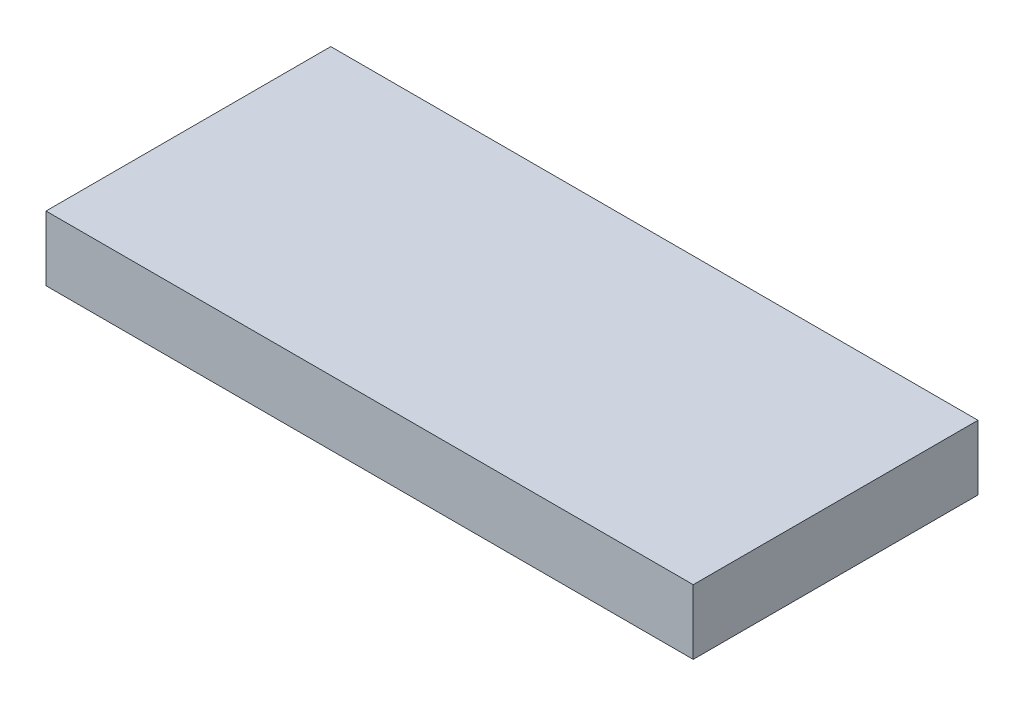
ISO-10303-21;
HEADER;
FILE_DESCRIPTION(('STEP AP214'),'2;1');
FILE_NAME('part.step','',(''),(''),'','','');
FILE_SCHEMA(('AUTOMOTIVE_DESIGN { 1 0 10303 214 1 1 1 1 }'));
ENDSEC;
DATA;
#1=APPLICATION_CONTEXT('core data for automotive mechanical design processes');
#2=APPLICATION_PROTOCOL_DEFINITION('international standard','automotive_design',2000,#1);
#3=PRODUCT_CONTEXT('',#1,'mechanical');
#4=PRODUCT('Part','Part','',(#3));
#5=PRODUCT_RELATED_PRODUCT_CATEGORY('part','',(#4));
#6=PRODUCT_DEFINITION_FORMATION('','',#4);
#7=PRODUCT_DEFINITION_CONTEXT('part definition',#1,'design');
#8=PRODUCT_DEFINITION('design','',#6,#7);
#9=PRODUCT_DEFINITION_SHAPE('','',#8);
#10=(LENGTH_UNIT() NAMED_UNIT(*) SI_UNIT(.MILLI.,.METRE.));
#11=(NAMED_UNIT(*) PLANE_ANGLE_UNIT() SI_UNIT($,.RADIAN.));
#12=(NAMED_UNIT(*) SI_UNIT($,.STERADIAN.) SOLID_ANGLE_UNIT());
#13=UNCERTAINTY_MEASURE_WITH_UNIT(LENGTH_MEASURE(1.E-05),#10,'distance_accuracy_value','');
#14=(GEOMETRIC_REPRESENTATION_CONTEXT(3) GLOBAL_UNCERTAINTY_ASSIGNED_CONTEXT((#13)) GLOBAL_UNIT_ASSIGNED_CONTEXT((#10,
#11,#12)) REPRESENTATION_CONTEXT('',''));
#15=CARTESIAN_POINT('',(0.,0.,0.));
#16=DIRECTION('',(0.,0.,1.));
#17=DIRECTION('',(1.,0.,0.));
#18=AXIS2_PLACEMENT_3D('',#15,#16,#17);
#19=CARTESIAN_POINT('',(0.,5.,0.));
#20=DIRECTION('',(1.,0.,0.));
#21=DIRECTION('',(0.,0.,-1.));
#22=AXIS2_PLACEMENT_3D('',#19,#20,#21);
#23=PLANE('',#22);
#24=DIRECTION('',(0.,0.,1.));
#25=VECTOR('',#24,1.);
#26=CARTESIAN_POINT('',(0.,0.,0.));
#27=LINE('',#26,#25);
#28=CARTESIAN_POINT('',(0.,0.,-22.));
#29=VERTEX_POINT('',#28);
#30=CARTESIAN_POINT('',(0.,0.,0.));
#31=VERTEX_POINT('',#30);
#32=EDGE_CURVE('E95',#29,#31,#27,.T.);
#33=ORIENTED_EDGE('',*,*,#32,.T.);
#34=DIRECTION('',(0.,-1.,0.));
#35=VECTOR('',#34,1.);
#36=CARTESIAN_POINT('',(0.,5.,0.));
#37=LINE('',#36,#35);
#38=CARTESIAN_POINT('',(0.,5.,0.));
#39=VERTEX_POINT('',#38);
#40=EDGE_CURVE('E11',#39,#31,#37,.T.);
#41=ORIENTED_EDGE('',*,*,#40,.F.);
#42=DIRECTION('',(0.,0.,1.));
#43=VECTOR('',#42,1.);
#44=CARTESIAN_POINT('',(0.,5.,0.));
#45=LINE('',#44,#43);
#46=CARTESIAN_POINT('',(0.,5.,-22.));
#47=VERTEX_POINT('',#46);
#48=EDGE_CURVE('E83',#47,#39,#45,.T.);
#49=ORIENTED_EDGE('',*,*,#48,.F.);
#50=DIRECTION('',(0.,-1.,0.));
#51=VECTOR('',#50,1.);
#52=CARTESIAN_POINT('',(0.,5.,-22.));
#53=LINE('',#52,#51);
#54=EDGE_CURVE('E91',#47,#29,#53,.T.);
#55=ORIENTED_EDGE('',*,*,#54,.T.);
#56=EDGE_LOOP('',(#33,#41,#49,#55));
#57=FACE_BOUND('',#56,.T.);
#58=ADVANCED_FACE('F32',(#57),#23,.F.);
#59=CARTESIAN_POINT('',(0.,5.,0.));
#60=DIRECTION('',(0.,0.,-1.));
#61=DIRECTION('',(-1.,0.,0.));
#62=AXIS2_PLACEMENT_3D('',#59,#60,#61);
#63=PLANE('',#62);
#64=DIRECTION('',(1.,0.,0.));
#65=VECTOR('',#64,1.);
#66=CARTESIAN_POINT('',(0.,0.,0.));
#67=LINE('',#66,#65);
#68=CARTESIAN_POINT('',(50.,0.,0.));
#69=VERTEX_POINT('',#68);
#70=EDGE_CURVE('E87',#31,#69,#67,.T.);
#71=ORIENTED_EDGE('',*,*,#70,.T.);
#72=DIRECTION('',(0.,-1.,0.));
#73=VECTOR('',#72,1.);
#74=CARTESIAN_POINT('',(50.,5.,0.));
#75=LINE('',#74,#73);
#76=CARTESIAN_POINT('',(50.,5.,0.));
#77=VERTEX_POINT('',#76);
#78=EDGE_CURVE('E40',#77,#69,#75,.T.);
#79=ORIENTED_EDGE('',*,*,#78,.F.);
#80=DIRECTION('',(1.,0.,0.));
#81=VECTOR('',#80,1.);
#82=CARTESIAN_POINT('',(0.,5.,0.));
#83=LINE('',#82,#81);
#84=EDGE_CURVE('E78',#39,#77,#83,.T.);
#85=ORIENTED_EDGE('',*,*,#84,.F.);
#86=ORIENTED_EDGE('',*,*,#40,.T.);
#87=EDGE_LOOP('',(#71,#79,#85,#86));
#88=FACE_BOUND('',#87,.T.);
#89=ADVANCED_FACE('F86',(#88),#63,.F.);
#90=CARTESIAN_POINT('',(50.,5.,0.));
#91=DIRECTION('',(-1.,0.,0.));
#92=DIRECTION('',(0.,0.,1.));
#93=AXIS2_PLACEMENT_3D('',#90,#91,#92);
#94=PLANE('',#93);
#95=DIRECTION('',(0.,0.,-1.));
#96=VECTOR('',#95,1.);
#97=CARTESIAN_POINT('',(50.,0.,0.));
#98=LINE('',#97,#96);
#99=CARTESIAN_POINT('',(50.,0.,-22.));
#100=VERTEX_POINT('',#99);
#101=EDGE_CURVE('E65',#69,#100,#98,.T.);
#102=ORIENTED_EDGE('',*,*,#101,.T.);
#103=DIRECTION('',(0.,-1.,0.));
#104=VECTOR('',#103,1.);
#105=CARTESIAN_POINT('',(50.,5.,-22.));
#106=LINE('',#105,#104);
#107=CARTESIAN_POINT('',(50.,5.,-22.));
#108=VERTEX_POINT('',#107);
#109=EDGE_CURVE('E88',#108,#100,#106,.T.);
#110=ORIENTED_EDGE('',*,*,#109,.F.);
#111=DIRECTION('',(0.,0.,-1.));
#112=VECTOR('',#111,1.);
#113=CARTESIAN_POINT('',(50.,5.,0.));
#114=LINE('',#113,#112);
#115=EDGE_CURVE('E81',#77,#108,#114,.T.);
#116=ORIENTED_EDGE('',*,*,#115,.F.);
#117=ORIENTED_EDGE('',*,*,#78,.T.);
#118=EDGE_LOOP('',(#102,#110,#116,#117));
#119=FACE_BOUND('',#118,.T.);
#120=ADVANCED_FACE('F89',(#119),#94,.F.);
#121=CARTESIAN_POINT('',(0.,5.,-22.));
#122=DIRECTION('',(0.,0.,1.));
#123=DIRECTION('',(1.,0.,0.));
#124=AXIS2_PLACEMENT_3D('',#121,#122,#123);
#125=PLANE('',#124);
#126=DIRECTION('',(-1.,0.,0.));
#127=VECTOR('',#126,1.);
#128=CARTESIAN_POINT('',(0.,0.,-22.));
#129=LINE('',#128,#127);
#130=EDGE_CURVE('E71',#100,#29,#129,.T.);
#131=ORIENTED_EDGE('',*,*,#130,.T.);
#132=ORIENTED_EDGE('',*,*,#54,.F.);
#133=DIRECTION('',(-1.,0.,0.));
#134=VECTOR('',#133,1.);
#135=CARTESIAN_POINT('',(0.,5.,-22.));
#136=LINE('',#135,#134);
#137=EDGE_CURVE('E48',#108,#47,#136,.T.);
#138=ORIENTED_EDGE('',*,*,#137,.F.);
#139=ORIENTED_EDGE('',*,*,#109,.T.);
#140=EDGE_LOOP('',(#131,#132,#138,#139));
#141=FACE_BOUND('',#140,.T.);
#142=ADVANCED_FACE('F102',(#141),#125,.F.);
#143=CARTESIAN_POINT('',(0.,5.,0.));
#144=DIRECTION('',(0.,-1.,0.));
#145=DIRECTION('',(0.,0.,-1.));
#146=AXIS2_PLACEMENT_3D('',#143,#144,#145);
#147=PLANE('',#146);
#148=ORIENTED_EDGE('',*,*,#48,.T.);
#149=ORIENTED_EDGE('',*,*,#84,.T.);
#150=ORIENTED_EDGE('',*,*,#115,.T.);
#151=ORIENTED_EDGE('',*,*,#137,.T.);
#152=EDGE_LOOP('',(#148,#149,#150,#151));
#153=FACE_BOUND('',#152,.T.);
#154=ADVANCED_FACE('F79',(#153),#147,.F.);
#155=CARTESIAN_POINT('',(0.,0.,0.));
#156=DIRECTION('',(0.,-1.,0.));
#157=DIRECTION('',(0.,0.,-1.));
#158=AXIS2_PLACEMENT_3D('',#155,#156,#157);
#159=PLANE('',#158);
#160=ORIENTED_EDGE('',*,*,#32,.F.);
#161=ORIENTED_EDGE('',*,*,#130,.F.);
#162=ORIENTED_EDGE('',*,*,#101,.F.);
#163=ORIENTED_EDGE('',*,*,#70,.F.);
#164=EDGE_LOOP('',(#160,#161,#162,#163));
#165=FACE_BOUND('',#164,.T.);
#166=ADVANCED_FACE('F105',(#165),#159,.T.);
#167=CLOSED_SHELL('',(#58,#89,#120,#142,#154,#166));
#168=MANIFOLD_SOLID_BREP('B2',#167);
#169=ADVANCED_BREP_SHAPE_REPRESENTATION('',(#18,#168),#14);
#170=SHAPE_DEFINITION_REPRESENTATION(#9,#169);
ENDSEC;
END-ISO-10303-21;
